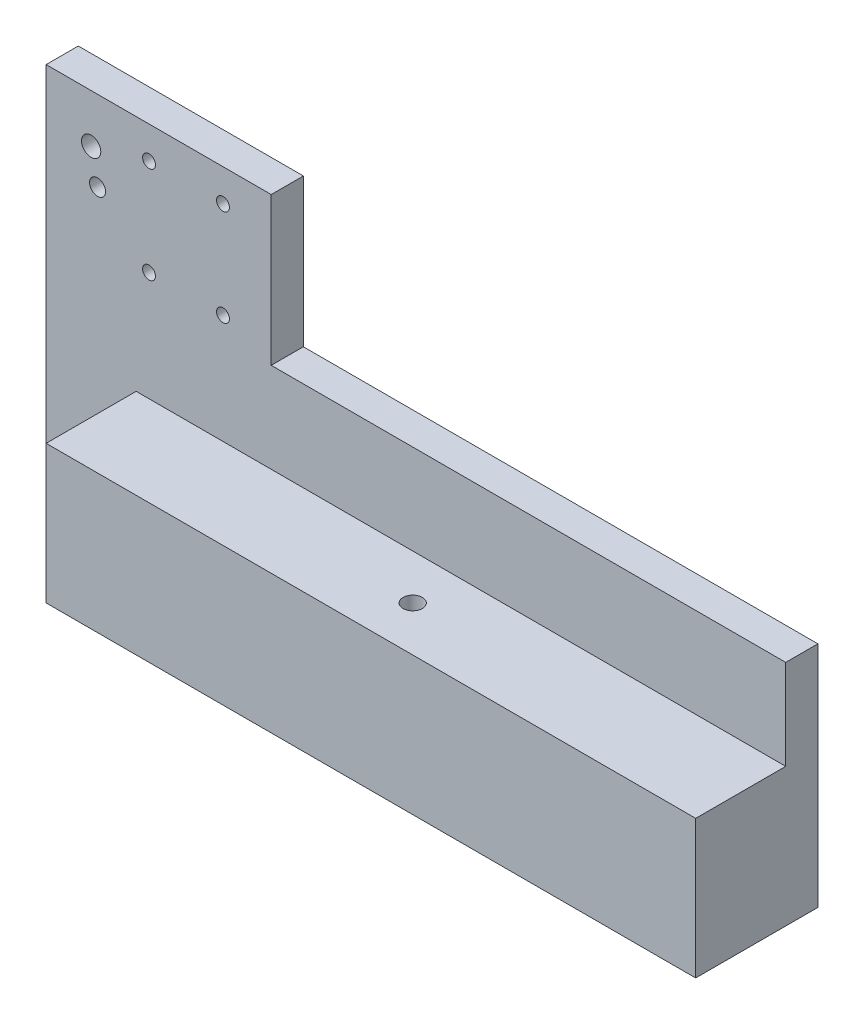
ISO-10303-21;
HEADER;
FILE_DESCRIPTION(('STEP AP214'),'2;1');
FILE_NAME('part.step','',(''),(''),'','','');
FILE_SCHEMA(('AUTOMOTIVE_DESIGN { 1 0 10303 214 1 1 1 1 }'));
ENDSEC;
DATA;
#1=APPLICATION_CONTEXT('core data for automotive mechanical design processes');
#2=APPLICATION_PROTOCOL_DEFINITION('international standard','automotive_design',2000,#1);
#3=PRODUCT_CONTEXT('',#1,'mechanical');
#4=PRODUCT('Part','Part','',(#3));
#5=PRODUCT_RELATED_PRODUCT_CATEGORY('part','',(#4));
#6=PRODUCT_DEFINITION_FORMATION('','',#4);
#7=PRODUCT_DEFINITION_CONTEXT('part definition',#1,'design');
#8=PRODUCT_DEFINITION('design','',#6,#7);
#9=PRODUCT_DEFINITION_SHAPE('','',#8);
#10=(LENGTH_UNIT() NAMED_UNIT(*) SI_UNIT(.MILLI.,.METRE.));
#11=(NAMED_UNIT(*) PLANE_ANGLE_UNIT() SI_UNIT($,.RADIAN.));
#12=(NAMED_UNIT(*) SI_UNIT($,.STERADIAN.) SOLID_ANGLE_UNIT());
#13=UNCERTAINTY_MEASURE_WITH_UNIT(LENGTH_MEASURE(1.E-05),#10,'distance_accuracy_value','');
#14=(GEOMETRIC_REPRESENTATION_CONTEXT(3) GLOBAL_UNCERTAINTY_ASSIGNED_CONTEXT((#13)) GLOBAL_UNIT_ASSIGNED_CONTEXT((#10,
#11,#12)) REPRESENTATION_CONTEXT('',''));
#15=CARTESIAN_POINT('',(0.,0.,0.));
#16=DIRECTION('',(0.,0.,1.));
#17=DIRECTION('',(1.,0.,0.));
#18=AXIS2_PLACEMENT_3D('',#15,#16,#17);
#19=CARTESIAN_POINT('',(0.,0.,38.));
#20=DIRECTION('',(1.,0.,0.));
#21=DIRECTION('',(0.,1.,0.));
#22=AXIS2_PLACEMENT_3D('',#19,#20,#21);
#23=PLANE('',#22);
#24=DIRECTION('',(0.,-1.,0.));
#25=VECTOR('',#24,1.);
#26=CARTESIAN_POINT('',(0.,0.,0.));
#27=LINE('',#26,#25);
#28=CARTESIAN_POINT('',(0.,0.,0.));
#29=VERTEX_POINT('',#28);
#30=CARTESIAN_POINT('',(0.,-117.,0.));
#31=VERTEX_POINT('',#30);
#32=EDGE_CURVE('E137',#29,#31,#27,.T.);
#33=ORIENTED_EDGE('',*,*,#32,.T.);
#34=DIRECTION('',(0.,0.,1.));
#35=VECTOR('',#34,1.);
#36=CARTESIAN_POINT('',(0.,-117.,38.));
#37=LINE('',#36,#35);
#38=CARTESIAN_POINT('',(0.,-117.,10.));
#39=VERTEX_POINT('',#38);
#40=EDGE_CURVE('E172',#31,#39,#37,.T.);
#41=ORIENTED_EDGE('',*,*,#40,.T.);
#42=DIRECTION('',(0.,-1.,0.));
#43=VECTOR('',#42,1.);
#44=CARTESIAN_POINT('',(0.,0.,10.));
#45=LINE('',#44,#43);
#46=CARTESIAN_POINT('',(0.,0.,10.));
#47=VERTEX_POINT('',#46);
#48=EDGE_CURVE('E202',#47,#39,#45,.T.);
#49=ORIENTED_EDGE('',*,*,#48,.F.);
#50=DIRECTION('',(0.,0.,-1.));
#51=VECTOR('',#50,1.);
#52=CARTESIAN_POINT('',(0.,0.,38.));
#53=LINE('',#52,#51);
#54=EDGE_CURVE('E41',#47,#29,#53,.T.);
#55=ORIENTED_EDGE('',*,*,#54,.T.);
#56=EDGE_LOOP('',(#33,#41,#49,#55));
#57=FACE_BOUND('',#56,.T.);
#58=ADVANCED_FACE('F33',(#57),#23,.F.);
#59=CARTESIAN_POINT('',(0.,0.,38.));
#60=DIRECTION('',(0.,-1.,0.));
#61=DIRECTION('',(0.,0.,-1.));
#62=AXIS2_PLACEMENT_3D('',#59,#60,#61);
#63=PLANE('',#62);
#64=DIRECTION('',(-1.,0.,0.));
#65=VECTOR('',#64,1.);
#66=CARTESIAN_POINT('',(0.,0.,10.));
#67=LINE('',#66,#65);
#68=CARTESIAN_POINT('',(70.,0.,10.));
#69=VERTEX_POINT('',#68);
#70=EDGE_CURVE('E200',#69,#47,#67,.T.);
#71=ORIENTED_EDGE('',*,*,#70,.F.);
#72=DIRECTION('',(0.,0.,1.));
#73=VECTOR('',#72,1.);
#74=CARTESIAN_POINT('',(70.,0.,0.));
#75=LINE('',#74,#73);
#76=CARTESIAN_POINT('',(70.,0.,0.));
#77=VERTEX_POINT('',#76);
#78=EDGE_CURVE('E56',#77,#69,#75,.T.);
#79=ORIENTED_EDGE('',*,*,#78,.F.);
#80=DIRECTION('',(-1.,0.,0.));
#81=VECTOR('',#80,1.);
#82=CARTESIAN_POINT('',(0.,0.,0.));
#83=LINE('',#82,#81);
#84=EDGE_CURVE('E127',#77,#29,#83,.T.);
#85=ORIENTED_EDGE('',*,*,#84,.T.);
#86=ORIENTED_EDGE('',*,*,#54,.F.);
#87=EDGE_LOOP('',(#71,#79,#85,#86));
#88=FACE_BOUND('',#87,.T.);
#89=ADVANCED_FACE('F230',(#88),#63,.F.);
#90=CARTESIAN_POINT('',(230.,0.,38.));
#91=DIRECTION('',(-1.,0.,0.));
#92=DIRECTION('',(0.,-1.,0.));
#93=AXIS2_PLACEMENT_3D('',#90,#91,#92);
#94=PLANE('',#93);
#95=DIRECTION('',(0.,1.,0.));
#96=VECTOR('',#95,1.);
#97=CARTESIAN_POINT('',(230.,0.,38.));
#98=LINE('',#97,#96);
#99=CARTESIAN_POINT('',(230.,-117.,38.));
#100=VERTEX_POINT('',#99);
#101=CARTESIAN_POINT('',(230.,-74.,38.));
#102=VERTEX_POINT('',#101);
#103=EDGE_CURVE('E118',#100,#102,#98,.T.);
#104=ORIENTED_EDGE('',*,*,#103,.F.);
#105=DIRECTION('',(0.,0.,-1.));
#106=VECTOR('',#105,1.);
#107=CARTESIAN_POINT('',(230.,-117.,38.));
#108=LINE('',#107,#106);
#109=CARTESIAN_POINT('',(230.,-117.,0.));
#110=VERTEX_POINT('',#109);
#111=EDGE_CURVE('E103',#100,#110,#108,.T.);
#112=ORIENTED_EDGE('',*,*,#111,.T.);
#113=DIRECTION('',(0.,1.,0.));
#114=VECTOR('',#113,1.);
#115=CARTESIAN_POINT('',(230.,0.,0.));
#116=LINE('',#115,#114);
#117=CARTESIAN_POINT('',(230.,-46.,0.));
#118=VERTEX_POINT('',#117);
#119=EDGE_CURVE('E131',#110,#118,#116,.T.);
#120=ORIENTED_EDGE('',*,*,#119,.T.);
#121=DIRECTION('',(0.,0.,1.));
#122=VECTOR('',#121,1.);
#123=CARTESIAN_POINT('',(230.,-46.,0.));
#124=LINE('',#123,#122);
#125=CARTESIAN_POINT('',(230.,-46.,10.));
#126=VERTEX_POINT('',#125);
#127=EDGE_CURVE('E185',#118,#126,#124,.T.);
#128=ORIENTED_EDGE('',*,*,#127,.T.);
#129=DIRECTION('',(0.,1.,0.));
#130=VECTOR('',#129,1.);
#131=CARTESIAN_POINT('',(230.,0.,10.));
#132=LINE('',#131,#130);
#133=CARTESIAN_POINT('',(230.,-74.,10.));
#134=VERTEX_POINT('',#133);
#135=EDGE_CURVE('E197',#134,#126,#132,.T.);
#136=ORIENTED_EDGE('',*,*,#135,.F.);
#137=DIRECTION('',(0.,0.,1.));
#138=VECTOR('',#137,1.);
#139=CARTESIAN_POINT('',(230.,-74.,10.));
#140=LINE('',#139,#138);
#141=EDGE_CURVE('E126',#134,#102,#140,.T.);
#142=ORIENTED_EDGE('',*,*,#141,.T.);
#143=EDGE_LOOP('',(#104,#112,#120,#128,#136,#142));
#144=FACE_BOUND('',#143,.T.);
#145=ADVANCED_FACE('F124',(#144),#94,.F.);
#146=CARTESIAN_POINT('',(0.,0.,38.));
#147=DIRECTION('',(0.,0.,1.));
#148=DIRECTION('',(1.,0.,0.));
#149=AXIS2_PLACEMENT_3D('',#146,#147,#148);
#150=PLANE('',#149);
#151=DIRECTION('',(-1.,0.,0.));
#152=VECTOR('',#151,1.);
#153=CARTESIAN_POINT('',(-45.2027502037625,-117.,38.));
#154=LINE('',#153,#152);
#155=CARTESIAN_POINT('',(28.,-117.,38.));
#156=VERTEX_POINT('',#155);
#157=EDGE_CURVE('E106',#100,#156,#154,.T.);
#158=ORIENTED_EDGE('',*,*,#157,.F.);
#159=ORIENTED_EDGE('',*,*,#103,.T.);
#160=DIRECTION('',(1.,0.,0.));
#161=VECTOR('',#160,1.);
#162=CARTESIAN_POINT('',(28.,-74.,38.));
#163=LINE('',#162,#161);
#164=CARTESIAN_POINT('',(28.,-74.,38.));
#165=VERTEX_POINT('',#164);
#166=EDGE_CURVE('E194',#165,#102,#163,.T.);
#167=ORIENTED_EDGE('',*,*,#166,.F.);
#168=DIRECTION('',(0.,1.,0.));
#169=VECTOR('',#168,1.);
#170=CARTESIAN_POINT('',(28.,-120.,38.));
#171=LINE('',#170,#169);
#172=EDGE_CURVE('E120',#156,#165,#171,.T.);
#173=ORIENTED_EDGE('',*,*,#172,.F.);
#174=EDGE_LOOP('',(#158,#159,#167,#173));
#175=FACE_BOUND('',#174,.T.);
#176=ADVANCED_FACE('F116',(#175),#150,.T.);
#177=CARTESIAN_POINT('',(0.,0.,0.));
#178=DIRECTION('',(0.,0.,1.));
#179=DIRECTION('',(1.,0.,0.));
#180=AXIS2_PLACEMENT_3D('',#177,#178,#179);
#181=PLANE('',#180);
#182=CARTESIAN_POINT('',(16.,-25.,0.));
#183=DIRECTION('',(0.,0.,-1.));
#184=DIRECTION('',(-1.,0.,0.));
#185=AXIS2_PLACEMENT_3D('',#182,#183,#184);
#186=CIRCLE('',#185,2.5);
#187=CARTESIAN_POINT('',(13.5,-25.,0.));
#188=VERTEX_POINT('',#187);
#189=EDGE_CURVE('E300',#188,#188,#186,.T.);
#190=ORIENTED_EDGE('',*,*,#189,.F.);
#191=EDGE_LOOP('',(#190));
#192=FACE_BOUND('',#191,.T.);
#193=CARTESIAN_POINT('',(32.,-10.,0.));
#194=DIRECTION('',(0.,0.,-1.));
#195=DIRECTION('',(-1.,0.,0.));
#196=AXIS2_PLACEMENT_3D('',#193,#194,#195);
#197=CIRCLE('',#196,2.);
#198=CARTESIAN_POINT('',(30.,-10.,0.));
#199=VERTEX_POINT('',#198);
#200=EDGE_CURVE('E302',#199,#199,#197,.T.);
#201=ORIENTED_EDGE('',*,*,#200,.F.);
#202=EDGE_LOOP('',(#201));
#203=FACE_BOUND('',#202,.T.);
#204=CARTESIAN_POINT('',(32.,-40.,0.));
#205=DIRECTION('',(0.,0.,-1.));
#206=DIRECTION('',(-1.,0.,0.));
#207=AXIS2_PLACEMENT_3D('',#204,#205,#206);
#208=CIRCLE('',#207,2.);
#209=CARTESIAN_POINT('',(30.,-40.,0.));
#210=VERTEX_POINT('',#209);
#211=EDGE_CURVE('E307',#210,#210,#208,.T.);
#212=ORIENTED_EDGE('',*,*,#211,.F.);
#213=EDGE_LOOP('',(#212));
#214=FACE_BOUND('',#213,.T.);
#215=CARTESIAN_POINT('',(55.,-40.,0.));
#216=DIRECTION('',(0.,0.,-1.));
#217=DIRECTION('',(-1.,0.,0.));
#218=AXIS2_PLACEMENT_3D('',#215,#216,#217);
#219=CIRCLE('',#218,2.);
#220=CARTESIAN_POINT('',(53.,-40.,0.));
#221=VERTEX_POINT('',#220);
#222=EDGE_CURVE('E304',#221,#221,#219,.T.);
#223=ORIENTED_EDGE('',*,*,#222,.F.);
#224=EDGE_LOOP('',(#223));
#225=FACE_BOUND('',#224,.T.);
#226=CARTESIAN_POINT('',(55.,-10.,0.));
#227=DIRECTION('',(0.,0.,-1.));
#228=DIRECTION('',(-1.,0.,0.));
#229=AXIS2_PLACEMENT_3D('',#226,#227,#228);
#230=CIRCLE('',#229,2.);
#231=CARTESIAN_POINT('',(53.,-10.,0.));
#232=VERTEX_POINT('',#231);
#233=EDGE_CURVE('E145',#232,#232,#230,.T.);
#234=ORIENTED_EDGE('',*,*,#233,.F.);
#235=EDGE_LOOP('',(#234));
#236=FACE_BOUND('',#235,.T.);
#237=CARTESIAN_POINT('',(14.,-15.,0.));
#238=DIRECTION('',(0.,0.,1.));
#239=DIRECTION('',(1.,0.,0.));
#240=AXIS2_PLACEMENT_3D('',#237,#238,#239);
#241=CIRCLE('',#240,3.);
#242=CARTESIAN_POINT('',(17.,-15.,0.));
#243=VERTEX_POINT('',#242);
#244=EDGE_CURVE('E169',#243,#243,#241,.T.);
#245=ORIENTED_EDGE('',*,*,#244,.T.);
#246=EDGE_LOOP('',(#245));
#247=FACE_BOUND('',#246,.T.);
#248=CARTESIAN_POINT('',(14.,-102.,0.));
#249=DIRECTION('',(0.,0.,1.));
#250=DIRECTION('',(1.,0.,0.));
#251=AXIS2_PLACEMENT_3D('',#248,#249,#250);
#252=CIRCLE('',#251,3.);
#253=CARTESIAN_POINT('',(17.,-102.,0.));
#254=VERTEX_POINT('',#253);
#255=EDGE_CURVE('E156',#254,#254,#252,.T.);
#256=ORIENTED_EDGE('',*,*,#255,.T.);
#257=EDGE_LOOP('',(#256));
#258=FACE_BOUND('',#257,.T.);
#259=ORIENTED_EDGE('',*,*,#119,.F.);
#260=DIRECTION('',(-1.,0.,0.));
#261=VECTOR('',#260,1.);
#262=CARTESIAN_POINT('',(0.,-117.,0.));
#263=LINE('',#262,#261);
#264=EDGE_CURVE('E108',#110,#31,#263,.T.);
#265=ORIENTED_EDGE('',*,*,#264,.T.);
#266=ORIENTED_EDGE('',*,*,#32,.F.);
#267=ORIENTED_EDGE('',*,*,#84,.F.);
#268=DIRECTION('',(0.,-1.,0.));
#269=VECTOR('',#268,1.);
#270=CARTESIAN_POINT('',(70.,0.,0.));
#271=LINE('',#270,#269);
#272=CARTESIAN_POINT('',(70.,-46.,0.));
#273=VERTEX_POINT('',#272);
#274=EDGE_CURVE('E176',#77,#273,#271,.T.);
#275=ORIENTED_EDGE('',*,*,#274,.T.);
#276=DIRECTION('',(1.,0.,0.));
#277=VECTOR('',#276,1.);
#278=CARTESIAN_POINT('',(230.,-46.,0.));
#279=LINE('',#278,#277);
#280=EDGE_CURVE('E179',#273,#118,#279,.T.);
#281=ORIENTED_EDGE('',*,*,#280,.T.);
#282=EDGE_LOOP('',(#259,#265,#266,#267,#275,#281));
#283=FACE_BOUND('',#282,.T.);
#284=ADVANCED_FACE('F222',(#192,#203,#214,#225,#236,#247,#258,#283),#181,.F.);
#285=CARTESIAN_POINT('',(28.,-74.,10.));
#286=DIRECTION('',(0.,-1.,0.));
#287=DIRECTION('',(0.,0.,-1.));
#288=AXIS2_PLACEMENT_3D('',#285,#286,#287);
#289=PLANE('',#288);
#290=CARTESIAN_POINT('',(128.,-74.,24.));
#291=DIRECTION('',(0.,1.,0.));
#292=DIRECTION('',(0.,0.,1.));
#293=AXIS2_PLACEMENT_3D('',#290,#291,#292);
#294=CIRCLE('',#293,2.99999999999999);
#295=CARTESIAN_POINT('',(128.,-74.,27.));
#296=VERTEX_POINT('',#295);
#297=EDGE_CURVE('E167',#296,#296,#294,.T.);
#298=ORIENTED_EDGE('',*,*,#297,.F.);
#299=EDGE_LOOP('',(#298));
#300=FACE_BOUND('',#299,.T.);
#301=ORIENTED_EDGE('',*,*,#166,.T.);
#302=ORIENTED_EDGE('',*,*,#141,.F.);
#303=DIRECTION('',(1.,0.,0.));
#304=VECTOR('',#303,1.);
#305=CARTESIAN_POINT('',(28.,-74.,10.));
#306=LINE('',#305,#304);
#307=CARTESIAN_POINT('',(28.,-74.,10.));
#308=VERTEX_POINT('',#307);
#309=EDGE_CURVE('E193',#308,#134,#306,.T.);
#310=ORIENTED_EDGE('',*,*,#309,.F.);
#311=DIRECTION('',(0.,0.,1.));
#312=VECTOR('',#311,1.);
#313=CARTESIAN_POINT('',(28.,-74.,10.));
#314=LINE('',#313,#312);
#315=EDGE_CURVE('E135',#308,#165,#314,.T.);
#316=ORIENTED_EDGE('',*,*,#315,.T.);
#317=EDGE_LOOP('',(#301,#302,#310,#316));
#318=FACE_BOUND('',#317,.T.);
#319=ADVANCED_FACE('F210',(#300,#318),#289,.F.);
#320=CARTESIAN_POINT('',(28.,-120.,10.));
#321=DIRECTION('',(1.,0.,0.));
#322=DIRECTION('',(0.,0.,-1.));
#323=AXIS2_PLACEMENT_3D('',#320,#321,#322);
#324=PLANE('',#323);
#325=DIRECTION('',(0.,1.,0.));
#326=VECTOR('',#325,1.);
#327=CARTESIAN_POINT('',(28.,-120.,10.));
#328=LINE('',#327,#326);
#329=CARTESIAN_POINT('',(28.,-117.,10.));
#330=VERTEX_POINT('',#329);
#331=EDGE_CURVE('E191',#330,#308,#328,.T.);
#332=ORIENTED_EDGE('',*,*,#331,.F.);
#333=DIRECTION('',(0.,0.,1.));
#334=VECTOR('',#333,1.);
#335=CARTESIAN_POINT('',(28.,-117.,10.));
#336=LINE('',#335,#334);
#337=EDGE_CURVE('E48',#330,#156,#336,.T.);
#338=ORIENTED_EDGE('',*,*,#337,.T.);
#339=ORIENTED_EDGE('',*,*,#172,.T.);
#340=ORIENTED_EDGE('',*,*,#315,.F.);
#341=EDGE_LOOP('',(#332,#338,#339,#340));
#342=FACE_BOUND('',#341,.T.);
#343=ADVANCED_FACE('F213',(#342),#324,.F.);
#344=CARTESIAN_POINT('',(0.,0.,10.));
#345=DIRECTION('',(0.,0.,1.));
#346=DIRECTION('',(1.,0.,0.));
#347=AXIS2_PLACEMENT_3D('',#344,#345,#346);
#348=PLANE('',#347);
#349=CARTESIAN_POINT('',(16.,-25.,10.));
#350=DIRECTION('',(0.,0.,1.));
#351=DIRECTION('',(1.,0.,0.));
#352=AXIS2_PLACEMENT_3D('',#349,#350,#351);
#353=CIRCLE('',#352,2.5);
#354=CARTESIAN_POINT('',(18.5,-25.,10.));
#355=VERTEX_POINT('',#354);
#356=EDGE_CURVE('E36',#355,#355,#353,.T.);
#357=ORIENTED_EDGE('',*,*,#356,.F.);
#358=EDGE_LOOP('',(#357));
#359=FACE_BOUND('',#358,.T.);
#360=CARTESIAN_POINT('',(32.,-10.,10.));
#361=DIRECTION('',(0.,0.,1.));
#362=DIRECTION('',(1.,0.,0.));
#363=AXIS2_PLACEMENT_3D('',#360,#361,#362);
#364=CIRCLE('',#363,2.);
#365=CARTESIAN_POINT('',(34.,-10.,10.));
#366=VERTEX_POINT('',#365);
#367=EDGE_CURVE('E150',#366,#366,#364,.T.);
#368=ORIENTED_EDGE('',*,*,#367,.F.);
#369=EDGE_LOOP('',(#368));
#370=FACE_BOUND('',#369,.T.);
#371=CARTESIAN_POINT('',(32.,-40.,10.));
#372=DIRECTION('',(0.,0.,1.));
#373=DIRECTION('',(1.,0.,0.));
#374=AXIS2_PLACEMENT_3D('',#371,#372,#373);
#375=CIRCLE('',#374,2.);
#376=CARTESIAN_POINT('',(34.,-40.,10.));
#377=VERTEX_POINT('',#376);
#378=EDGE_CURVE('E148',#377,#377,#375,.T.);
#379=ORIENTED_EDGE('',*,*,#378,.F.);
#380=EDGE_LOOP('',(#379));
#381=FACE_BOUND('',#380,.T.);
#382=CARTESIAN_POINT('',(55.,-40.,10.));
#383=DIRECTION('',(0.,0.,1.));
#384=DIRECTION('',(1.,0.,0.));
#385=AXIS2_PLACEMENT_3D('',#382,#383,#384);
#386=CIRCLE('',#385,2.);
#387=CARTESIAN_POINT('',(57.,-40.,10.));
#388=VERTEX_POINT('',#387);
#389=EDGE_CURVE('E144',#388,#388,#386,.T.);
#390=ORIENTED_EDGE('',*,*,#389,.F.);
#391=EDGE_LOOP('',(#390));
#392=FACE_BOUND('',#391,.T.);
#393=CARTESIAN_POINT('',(55.,-10.,10.));
#394=DIRECTION('',(0.,0.,1.));
#395=DIRECTION('',(1.,0.,0.));
#396=AXIS2_PLACEMENT_3D('',#393,#394,#395);
#397=CIRCLE('',#396,2.);
#398=CARTESIAN_POINT('',(57.,-10.,10.));
#399=VERTEX_POINT('',#398);
#400=EDGE_CURVE('E141',#399,#399,#397,.T.);
#401=ORIENTED_EDGE('',*,*,#400,.F.);
#402=EDGE_LOOP('',(#401));
#403=FACE_BOUND('',#402,.T.);
#404=CARTESIAN_POINT('',(14.,-15.,10.));
#405=DIRECTION('',(0.,0.,1.));
#406=DIRECTION('',(1.,0.,0.));
#407=AXIS2_PLACEMENT_3D('',#404,#405,#406);
#408=CIRCLE('',#407,3.);
#409=CARTESIAN_POINT('',(17.,-15.,10.));
#410=VERTEX_POINT('',#409);
#411=EDGE_CURVE('E161',#410,#410,#408,.T.);
#412=ORIENTED_EDGE('',*,*,#411,.F.);
#413=EDGE_LOOP('',(#412));
#414=FACE_BOUND('',#413,.T.);
#415=CARTESIAN_POINT('',(14.,-102.,10.));
#416=DIRECTION('',(0.,0.,1.));
#417=DIRECTION('',(1.,0.,0.));
#418=AXIS2_PLACEMENT_3D('',#415,#416,#417);
#419=CIRCLE('',#418,3.);
#420=CARTESIAN_POINT('',(17.,-102.,10.));
#421=VERTEX_POINT('',#420);
#422=EDGE_CURVE('E152',#421,#421,#419,.T.);
#423=ORIENTED_EDGE('',*,*,#422,.F.);
#424=EDGE_LOOP('',(#423));
#425=FACE_BOUND('',#424,.T.);
#426=DIRECTION('',(-1.,0.,0.));
#427=VECTOR('',#426,1.);
#428=CARTESIAN_POINT('',(0.,-117.,10.));
#429=LINE('',#428,#427);
#430=EDGE_CURVE('E11',#330,#39,#429,.T.);
#431=ORIENTED_EDGE('',*,*,#430,.F.);
#432=ORIENTED_EDGE('',*,*,#331,.T.);
#433=ORIENTED_EDGE('',*,*,#309,.T.);
#434=ORIENTED_EDGE('',*,*,#135,.T.);
#435=DIRECTION('',(1.,0.,0.));
#436=VECTOR('',#435,1.);
#437=CARTESIAN_POINT('',(230.,-46.,10.));
#438=LINE('',#437,#436);
#439=CARTESIAN_POINT('',(70.,-46.,10.));
#440=VERTEX_POINT('',#439);
#441=EDGE_CURVE('E180',#440,#126,#438,.T.);
#442=ORIENTED_EDGE('',*,*,#441,.F.);
#443=DIRECTION('',(0.,-1.,0.));
#444=VECTOR('',#443,1.);
#445=CARTESIAN_POINT('',(70.,0.,10.));
#446=LINE('',#445,#444);
#447=EDGE_CURVE('E112',#69,#440,#446,.T.);
#448=ORIENTED_EDGE('',*,*,#447,.F.);
#449=ORIENTED_EDGE('',*,*,#70,.T.);
#450=ORIENTED_EDGE('',*,*,#48,.T.);
#451=EDGE_LOOP('',(#431,#432,#433,#434,#442,#448,#449,#450));
#452=FACE_BOUND('',#451,.T.);
#453=ADVANCED_FACE('F215',(#359,#370,#381,#392,#403,#414,#425,#452),#348,.T.);
#454=CARTESIAN_POINT('',(230.,-46.,0.));
#455=DIRECTION('',(0.,-1.,0.));
#456=DIRECTION('',(1.,0.,0.));
#457=AXIS2_PLACEMENT_3D('',#454,#455,#456);
#458=PLANE('',#457);
#459=ORIENTED_EDGE('',*,*,#441,.T.);
#460=ORIENTED_EDGE('',*,*,#127,.F.);
#461=ORIENTED_EDGE('',*,*,#280,.F.);
#462=DIRECTION('',(0.,0.,1.));
#463=VECTOR('',#462,1.);
#464=CARTESIAN_POINT('',(70.,-46.,0.));
#465=LINE('',#464,#463);
#466=EDGE_CURVE('E188',#273,#440,#465,.T.);
#467=ORIENTED_EDGE('',*,*,#466,.T.);
#468=EDGE_LOOP('',(#459,#460,#461,#467));
#469=FACE_BOUND('',#468,.T.);
#470=ADVANCED_FACE('F226',(#469),#458,.F.);
#471=CARTESIAN_POINT('',(70.,0.,0.));
#472=DIRECTION('',(-1.,0.,0.));
#473=DIRECTION('',(0.,0.,1.));
#474=AXIS2_PLACEMENT_3D('',#471,#472,#473);
#475=PLANE('',#474);
#476=ORIENTED_EDGE('',*,*,#447,.T.);
#477=ORIENTED_EDGE('',*,*,#466,.F.);
#478=ORIENTED_EDGE('',*,*,#274,.F.);
#479=ORIENTED_EDGE('',*,*,#78,.T.);
#480=EDGE_LOOP('',(#476,#477,#478,#479));
#481=FACE_BOUND('',#480,.T.);
#482=ADVANCED_FACE('F252',(#481),#475,.F.);
#483=CARTESIAN_POINT('',(-45.2027502037625,-117.,-34.));
#484=DIRECTION('',(0.,1.,0.));
#485=DIRECTION('',(0.,0.,1.));
#486=AXIS2_PLACEMENT_3D('',#483,#484,#485);
#487=PLANE('',#486);
#488=ORIENTED_EDGE('',*,*,#157,.T.);
#489=ORIENTED_EDGE('',*,*,#337,.F.);
#490=ORIENTED_EDGE('',*,*,#430,.T.);
#491=ORIENTED_EDGE('',*,*,#40,.F.);
#492=ORIENTED_EDGE('',*,*,#264,.F.);
#493=ORIENTED_EDGE('',*,*,#111,.F.);
#494=EDGE_LOOP('',(#488,#489,#490,#491,#492,#493));
#495=FACE_BOUND('',#494,.T.);
#496=ADVANCED_FACE('F105',(#495),#487,.F.);
#497=CARTESIAN_POINT('',(128.,-89.,24.));
#498=DIRECTION('',(0.,1.,0.));
#499=DIRECTION('',(0.,0.,1.));
#500=AXIS2_PLACEMENT_3D('',#497,#498,#499);
#501=CYLINDRICAL_SURFACE('',#500,2.99999999999999);
#502=CARTESIAN_POINT('',(128.,-89.,24.));
#503=DIRECTION('',(0.,1.,0.));
#504=DIRECTION('',(0.,0.,1.));
#505=AXIS2_PLACEMENT_3D('',#502,#503,#504);
#506=CIRCLE('',#505,2.99999999999999);
#507=CARTESIAN_POINT('',(128.,-89.,27.));
#508=VERTEX_POINT('',#507);
#509=EDGE_CURVE('E121',#508,#508,#506,.T.);
#510=ORIENTED_EDGE('',*,*,#509,.F.);
#511=EDGE_LOOP('',(#510));
#512=FACE_BOUND('',#511,.T.);
#513=ORIENTED_EDGE('',*,*,#297,.T.);
#514=EDGE_LOOP('',(#513));
#515=FACE_BOUND('',#514,.T.);
#516=ADVANCED_FACE('F259',(#512,#515),#501,.F.);
#517=CARTESIAN_POINT('',(128.,-89.,24.));
#518=DIRECTION('',(0.,1.,0.));
#519=DIRECTION('',(0.,0.,1.));
#520=AXIS2_PLACEMENT_3D('',#517,#518,#519);
#521=PLANE('',#520);
#522=ORIENTED_EDGE('',*,*,#509,.T.);
#523=EDGE_LOOP('',(#522));
#524=FACE_BOUND('',#523,.T.);
#525=ADVANCED_FACE('F262',(#524),#521,.T.);
#526=CARTESIAN_POINT('',(14.,-102.,0.));
#527=DIRECTION('',(0.,0.,1.));
#528=DIRECTION('',(1.,0.,0.));
#529=AXIS2_PLACEMENT_3D('',#526,#527,#528);
#530=CYLINDRICAL_SURFACE('',#529,3.);
#531=ORIENTED_EDGE('',*,*,#255,.F.);
#532=EDGE_LOOP('',(#531));
#533=FACE_BOUND('',#532,.T.);
#534=ORIENTED_EDGE('',*,*,#422,.T.);
#535=EDGE_LOOP('',(#534));
#536=FACE_BOUND('',#535,.T.);
#537=ADVANCED_FACE('F266',(#533,#536),#530,.F.);
#538=CARTESIAN_POINT('',(14.,-15.,0.));
#539=DIRECTION('',(0.,0.,1.));
#540=DIRECTION('',(1.,0.,0.));
#541=AXIS2_PLACEMENT_3D('',#538,#539,#540);
#542=CYLINDRICAL_SURFACE('',#541,3.);
#543=ORIENTED_EDGE('',*,*,#244,.F.);
#544=EDGE_LOOP('',(#543));
#545=FACE_BOUND('',#544,.T.);
#546=ORIENTED_EDGE('',*,*,#411,.T.);
#547=EDGE_LOOP('',(#546));
#548=FACE_BOUND('',#547,.T.);
#549=ADVANCED_FACE('F270',(#545,#548),#542,.F.);
#550=CARTESIAN_POINT('',(55.,-10.,38.));
#551=DIRECTION('',(0.,0.,-1.));
#552=DIRECTION('',(-1.,0.,0.));
#553=AXIS2_PLACEMENT_3D('',#550,#551,#552);
#554=CYLINDRICAL_SURFACE('',#553,2.);
#555=ORIENTED_EDGE('',*,*,#400,.T.);
#556=EDGE_LOOP('',(#555));
#557=FACE_BOUND('',#556,.T.);
#558=ORIENTED_EDGE('',*,*,#233,.T.);
#559=EDGE_LOOP('',(#558));
#560=FACE_BOUND('',#559,.T.);
#561=ADVANCED_FACE('F274',(#557,#560),#554,.F.);
#562=CARTESIAN_POINT('',(55.,-40.,38.));
#563=DIRECTION('',(0.,0.,-1.));
#564=DIRECTION('',(-1.,0.,0.));
#565=AXIS2_PLACEMENT_3D('',#562,#563,#564);
#566=CYLINDRICAL_SURFACE('',#565,2.);
#567=ORIENTED_EDGE('',*,*,#389,.T.);
#568=EDGE_LOOP('',(#567));
#569=FACE_BOUND('',#568,.T.);
#570=ORIENTED_EDGE('',*,*,#222,.T.);
#571=EDGE_LOOP('',(#570));
#572=FACE_BOUND('',#571,.T.);
#573=ADVANCED_FACE('F278',(#569,#572),#566,.F.);
#574=CARTESIAN_POINT('',(32.,-40.,38.));
#575=DIRECTION('',(0.,0.,-1.));
#576=DIRECTION('',(-1.,0.,0.));
#577=AXIS2_PLACEMENT_3D('',#574,#575,#576);
#578=CYLINDRICAL_SURFACE('',#577,2.);
#579=ORIENTED_EDGE('',*,*,#378,.T.);
#580=EDGE_LOOP('',(#579));
#581=FACE_BOUND('',#580,.T.);
#582=ORIENTED_EDGE('',*,*,#211,.T.);
#583=EDGE_LOOP('',(#582));
#584=FACE_BOUND('',#583,.T.);
#585=ADVANCED_FACE('F284',(#581,#584),#578,.F.);
#586=CARTESIAN_POINT('',(32.,-10.,38.));
#587=DIRECTION('',(0.,0.,-1.));
#588=DIRECTION('',(-1.,0.,0.));
#589=AXIS2_PLACEMENT_3D('',#586,#587,#588);
#590=CYLINDRICAL_SURFACE('',#589,2.);
#591=ORIENTED_EDGE('',*,*,#367,.T.);
#592=EDGE_LOOP('',(#591));
#593=FACE_BOUND('',#592,.T.);
#594=ORIENTED_EDGE('',*,*,#200,.T.);
#595=EDGE_LOOP('',(#594));
#596=FACE_BOUND('',#595,.T.);
#597=ADVANCED_FACE('F280',(#593,#596),#590,.F.);
#598=CARTESIAN_POINT('',(16.,-25.,38.));
#599=DIRECTION('',(0.,0.,-1.));
#600=DIRECTION('',(-1.,0.,0.));
#601=AXIS2_PLACEMENT_3D('',#598,#599,#600);
#602=CYLINDRICAL_SURFACE('',#601,2.5);
#603=ORIENTED_EDGE('',*,*,#356,.T.);
#604=EDGE_LOOP('',(#603));
#605=FACE_BOUND('',#604,.T.);
#606=ORIENTED_EDGE('',*,*,#189,.T.);
#607=EDGE_LOOP('',(#606));
#608=FACE_BOUND('',#607,.T.);
#609=ADVANCED_FACE('F283',(#605,#608),#602,.F.);
#610=CLOSED_SHELL('',(#58,#89,#145,#176,#284,#319,#343,#453,#470,#482,#496,#516,#525,#537,#549,
#561,#573,#585,#597,#609));
#611=MANIFOLD_SOLID_BREP('B2',#610);
#612=ADVANCED_BREP_SHAPE_REPRESENTATION('',(#18,#611),#14);
#613=SHAPE_DEFINITION_REPRESENTATION(#9,#612);
ENDSEC;
END-ISO-10303-21;
